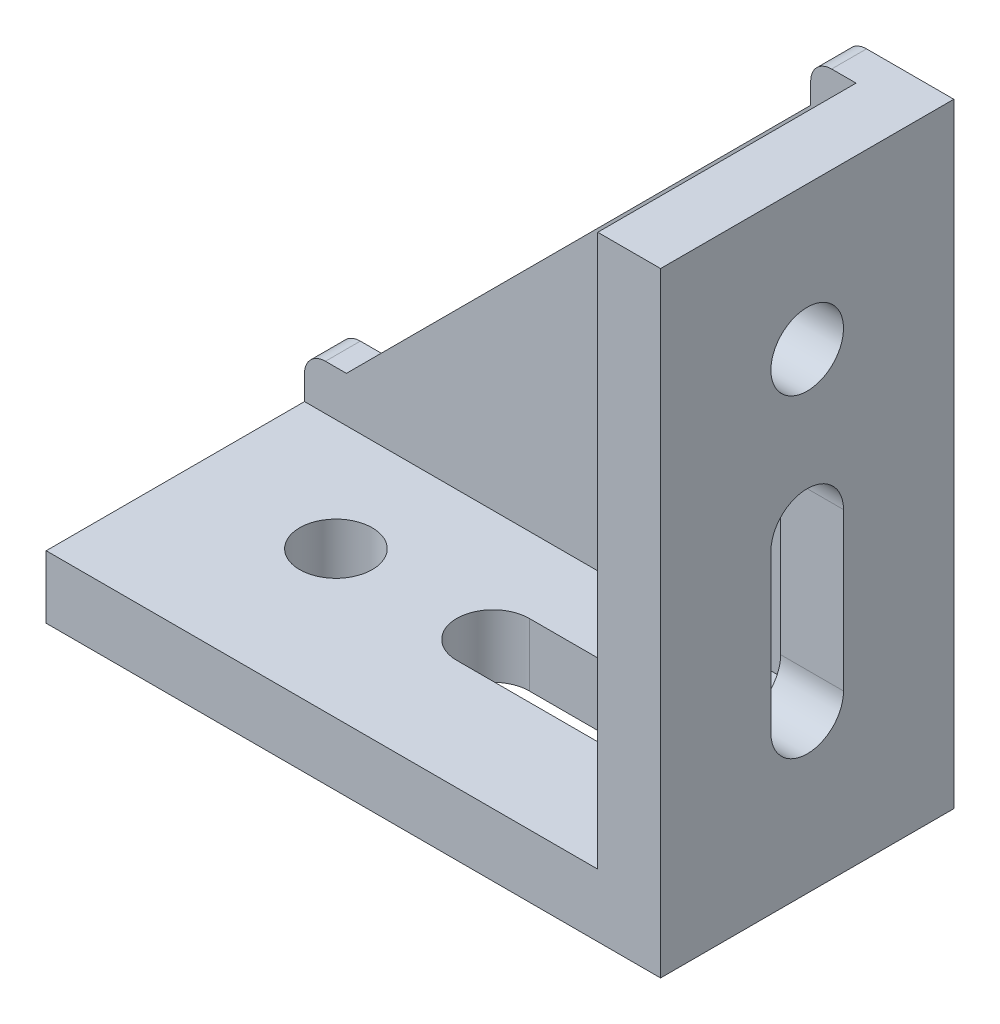
ISO-10303-21;
HEADER;
FILE_DESCRIPTION(('STEP AP214'),'2;1');
FILE_NAME('part.step','',(''),(''),'','','');
FILE_SCHEMA(('AUTOMOTIVE_DESIGN { 1 0 10303 214 1 1 1 1 }'));
ENDSEC;
DATA;
#1=APPLICATION_CONTEXT('core data for automotive mechanical design processes');
#2=APPLICATION_PROTOCOL_DEFINITION('international standard','automotive_design',2000,#1);
#3=PRODUCT_CONTEXT('',#1,'mechanical');
#4=PRODUCT('Part','Part','',(#3));
#5=PRODUCT_RELATED_PRODUCT_CATEGORY('part','',(#4));
#6=PRODUCT_DEFINITION_FORMATION('','',#4);
#7=PRODUCT_DEFINITION_CONTEXT('part definition',#1,'design');
#8=PRODUCT_DEFINITION('design','',#6,#7);
#9=PRODUCT_DEFINITION_SHAPE('','',#8);
#10=(LENGTH_UNIT() NAMED_UNIT(*) SI_UNIT(.MILLI.,.METRE.));
#11=(NAMED_UNIT(*) PLANE_ANGLE_UNIT() SI_UNIT($,.RADIAN.));
#12=(NAMED_UNIT(*) SI_UNIT($,.STERADIAN.) SOLID_ANGLE_UNIT());
#13=UNCERTAINTY_MEASURE_WITH_UNIT(LENGTH_MEASURE(1.E-05),#10,'distance_accuracy_value','');
#14=(GEOMETRIC_REPRESENTATION_CONTEXT(3) GLOBAL_UNCERTAINTY_ASSIGNED_CONTEXT((#13)) GLOBAL_UNIT_ASSIGNED_CONTEXT((#10,
#11,#12)) REPRESENTATION_CONTEXT('',''));
#15=CARTESIAN_POINT('',(0.,0.,0.));
#16=DIRECTION('',(0.,0.,1.));
#17=DIRECTION('',(1.,0.,0.));
#18=AXIS2_PLACEMENT_3D('',#15,#16,#17);
#19=CARTESIAN_POINT('',(-9.,9.,21.));
#20=DIRECTION('',(1.,0.,0.));
#21=DIRECTION('',(0.,0.,-1.));
#22=AXIS2_PLACEMENT_3D('',#19,#20,#21);
#23=PLANE('',#22);
#24=CARTESIAN_POINT('',(-8.99999999999998,45.,0.));
#25=DIRECTION('',(1.,0.,0.));
#26=DIRECTION('',(0.,0.,1.));
#27=AXIS2_PLACEMENT_3D('',#24,#25,#26);
#28=CIRCLE('',#27,5.2);
#29=CARTESIAN_POINT('',(-9.,45.,-5.2));
#30=VERTEX_POINT('',#29);
#31=CARTESIAN_POINT('',(-8.99999999999998,45.,5.2));
#32=VERTEX_POINT('',#31);
#33=EDGE_CURVE('E50',#30,#32,#28,.T.);
#34=ORIENTED_EDGE('',*,*,#33,.T.);
#35=DIRECTION('',(0.,-1.,0.));
#36=VECTOR('',#35,1.);
#37=CARTESIAN_POINT('',(-8.99999999999998,45.,5.2));
#38=LINE('',#37,#36);
#39=CARTESIAN_POINT('',(-8.99999999999999,22.5,5.2));
#40=VERTEX_POINT('',#39);
#41=EDGE_CURVE('E189',#32,#40,#38,.T.);
#42=ORIENTED_EDGE('',*,*,#41,.T.);
#43=CARTESIAN_POINT('',(-8.99999999999999,22.5,0.));
#44=DIRECTION('',(1.,0.,0.));
#45=DIRECTION('',(0.,0.,1.));
#46=AXIS2_PLACEMENT_3D('',#43,#44,#45);
#47=CIRCLE('',#46,5.2);
#48=CARTESIAN_POINT('',(-8.99999999999999,22.5,-5.2));
#49=VERTEX_POINT('',#48);
#50=EDGE_CURVE('E192',#40,#49,#47,.T.);
#51=ORIENTED_EDGE('',*,*,#50,.T.);
#52=DIRECTION('',(0.,1.,0.));
#53=VECTOR('',#52,1.);
#54=CARTESIAN_POINT('',(-8.99999999999998,45.,-5.2));
#55=LINE('',#54,#53);
#56=EDGE_CURVE('E201',#49,#30,#55,.T.);
#57=ORIENTED_EDGE('',*,*,#56,.T.);
#58=EDGE_LOOP('',(#34,#42,#51,#57));
#59=FACE_BOUND('',#58,.T.);
#60=DIRECTION('',(0.,-1.,0.));
#61=VECTOR('',#60,1.);
#62=CARTESIAN_POINT('',(-8.99999999999999,88.,-16.));
#63=LINE('',#62,#61);
#64=CARTESIAN_POINT('',(-9.,88.,-16.));
#65=VERTEX_POINT('',#64);
#66=CARTESIAN_POINT('',(-9.,9.,-16.));
#67=VERTEX_POINT('',#66);
#68=EDGE_CURVE('E274',#65,#67,#63,.T.);
#69=ORIENTED_EDGE('',*,*,#68,.T.);
#70=DIRECTION('',(0.,0.,-1.));
#71=VECTOR('',#70,1.);
#72=CARTESIAN_POINT('',(-9.,9.,21.));
#73=LINE('',#72,#71);
#74=CARTESIAN_POINT('',(-9.,9.,21.));
#75=VERTEX_POINT('',#74);
#76=EDGE_CURVE('E328',#75,#67,#73,.T.);
#77=ORIENTED_EDGE('',*,*,#76,.F.);
#78=DIRECTION('',(0.,-1.,0.));
#79=VECTOR('',#78,1.);
#80=CARTESIAN_POINT('',(-9.,9.,21.));
#81=LINE('',#80,#79);
#82=CARTESIAN_POINT('',(-9.,88.,21.));
#83=VERTEX_POINT('',#82);
#84=EDGE_CURVE('E314',#83,#75,#81,.T.);
#85=ORIENTED_EDGE('',*,*,#84,.F.);
#86=DIRECTION('',(0.,0.,-1.));
#87=VECTOR('',#86,1.);
#88=CARTESIAN_POINT('',(-9.,88.,21.));
#89=LINE('',#88,#87);
#90=EDGE_CURVE('E331',#83,#65,#89,.T.);
#91=ORIENTED_EDGE('',*,*,#90,.T.);
#92=EDGE_LOOP('',(#69,#77,#85,#91));
#93=FACE_BOUND('',#92,.T.);
#94=CARTESIAN_POINT('',(-8.99999999999997,67.5,0.));
#95=DIRECTION('',(1.,0.,0.));
#96=DIRECTION('',(0.,0.,1.));
#97=AXIS2_PLACEMENT_3D('',#94,#95,#96);
#98=CIRCLE('',#97,5.19999999999999);
#99=CARTESIAN_POINT('',(-8.99999999999997,67.5,5.19999999999999));
#100=VERTEX_POINT('',#99);
#101=EDGE_CURVE('E195',#100,#100,#98,.T.);
#102=ORIENTED_EDGE('',*,*,#101,.T.);
#103=EDGE_LOOP('',(#102));
#104=FACE_BOUND('',#103,.T.);
#105=ADVANCED_FACE('F35',(#59,#93,#104),#23,.F.);
#106=CARTESIAN_POINT('',(0.,0.,21.));
#107=DIRECTION('',(-1.,0.,0.));
#108=DIRECTION('',(0.,0.,1.));
#109=AXIS2_PLACEMENT_3D('',#106,#107,#108);
#110=PLANE('',#109);
#111=CARTESIAN_POINT('',(0.,45.,0.));
#112=DIRECTION('',(1.,0.,0.));
#113=DIRECTION('',(0.,0.,1.));
#114=AXIS2_PLACEMENT_3D('',#111,#112,#113);
#115=CIRCLE('',#114,5.2);
#116=CARTESIAN_POINT('',(0.,45.,-5.2));
#117=VERTEX_POINT('',#116);
#118=CARTESIAN_POINT('',(0.,45.,5.2));
#119=VERTEX_POINT('',#118);
#120=EDGE_CURVE('E180',#117,#119,#115,.T.);
#121=ORIENTED_EDGE('',*,*,#120,.F.);
#122=DIRECTION('',(0.,1.,0.));
#123=VECTOR('',#122,1.);
#124=CARTESIAN_POINT('',(0.,45.,-5.2));
#125=LINE('',#124,#123);
#126=CARTESIAN_POINT('',(0.,22.5,-5.2));
#127=VERTEX_POINT('',#126);
#128=EDGE_CURVE('E172',#127,#117,#125,.T.);
#129=ORIENTED_EDGE('',*,*,#128,.F.);
#130=CARTESIAN_POINT('',(0.,22.5,0.));
#131=DIRECTION('',(1.,0.,0.));
#132=DIRECTION('',(0.,0.,1.));
#133=AXIS2_PLACEMENT_3D('',#130,#131,#132);
#134=CIRCLE('',#133,5.2);
#135=CARTESIAN_POINT('',(0.,22.5,5.2));
#136=VERTEX_POINT('',#135);
#137=EDGE_CURVE('E179',#136,#127,#134,.T.);
#138=ORIENTED_EDGE('',*,*,#137,.F.);
#139=DIRECTION('',(0.,-1.,0.));
#140=VECTOR('',#139,1.);
#141=CARTESIAN_POINT('',(0.,45.,5.2));
#142=LINE('',#141,#140);
#143=EDGE_CURVE('E184',#119,#136,#142,.T.);
#144=ORIENTED_EDGE('',*,*,#143,.F.);
#145=EDGE_LOOP('',(#121,#129,#138,#144));
#146=FACE_BOUND('',#145,.T.);
#147=DIRECTION('',(0.,1.,0.));
#148=VECTOR('',#147,1.);
#149=CARTESIAN_POINT('',(0.,0.,-21.));
#150=LINE('',#149,#148);
#151=CARTESIAN_POINT('',(0.,0.,-21.));
#152=VERTEX_POINT('',#151);
#153=CARTESIAN_POINT('',(0.,88.,-21.));
#154=VERTEX_POINT('',#153);
#155=EDGE_CURVE('E323',#152,#154,#150,.T.);
#156=ORIENTED_EDGE('',*,*,#155,.T.);
#157=DIRECTION('',(0.,0.,-1.));
#158=VECTOR('',#157,1.);
#159=CARTESIAN_POINT('',(0.,88.,21.));
#160=LINE('',#159,#158);
#161=CARTESIAN_POINT('',(0.,88.,21.));
#162=VERTEX_POINT('',#161);
#163=EDGE_CURVE('E333',#162,#154,#160,.T.);
#164=ORIENTED_EDGE('',*,*,#163,.F.);
#165=DIRECTION('',(0.,1.,0.));
#166=VECTOR('',#165,1.);
#167=CARTESIAN_POINT('',(0.,0.,21.));
#168=LINE('',#167,#166);
#169=CARTESIAN_POINT('',(0.,0.,21.));
#170=VERTEX_POINT('',#169);
#171=EDGE_CURVE('E310',#170,#162,#168,.T.);
#172=ORIENTED_EDGE('',*,*,#171,.F.);
#173=DIRECTION('',(0.,0.,-1.));
#174=VECTOR('',#173,1.);
#175=CARTESIAN_POINT('',(0.,0.,21.));
#176=LINE('',#175,#174);
#177=EDGE_CURVE('E43',#170,#152,#176,.T.);
#178=ORIENTED_EDGE('',*,*,#177,.T.);
#179=EDGE_LOOP('',(#156,#164,#172,#178));
#180=FACE_BOUND('',#179,.T.);
#181=CARTESIAN_POINT('',(0.,67.5,0.));
#182=DIRECTION('',(1.,0.,0.));
#183=DIRECTION('',(0.,0.,1.));
#184=AXIS2_PLACEMENT_3D('',#181,#182,#183);
#185=CIRCLE('',#184,5.19999999999999);
#186=CARTESIAN_POINT('',(0.,67.5,5.19999999999999));
#187=VERTEX_POINT('',#186);
#188=EDGE_CURVE('E202',#187,#187,#185,.T.);
#189=ORIENTED_EDGE('',*,*,#188,.F.);
#190=EDGE_LOOP('',(#189));
#191=FACE_BOUND('',#190,.T.);
#192=ADVANCED_FACE('F187',(#146,#180,#191),#110,.F.);
#193=CARTESIAN_POINT('',(-88.,9.,21.));
#194=DIRECTION('',(0.,-1.,0.));
#195=DIRECTION('',(0.,0.,-1.));
#196=AXIS2_PLACEMENT_3D('',#193,#194,#195);
#197=PLANE('',#196);
#198=CARTESIAN_POINT('',(-67.5,9.,0.));
#199=DIRECTION('',(0.,1.,0.));
#200=DIRECTION('',(0.,0.,1.));
#201=AXIS2_PLACEMENT_3D('',#198,#199,#200);
#202=CIRCLE('',#201,5.19999999999999);
#203=CARTESIAN_POINT('',(-67.5,9.,5.19999999999999));
#204=VERTEX_POINT('',#203);
#205=EDGE_CURVE('E208',#204,#204,#202,.T.);
#206=ORIENTED_EDGE('',*,*,#205,.F.);
#207=EDGE_LOOP('',(#206));
#208=FACE_BOUND('',#207,.T.);
#209=DIRECTION('',(1.,0.,0.));
#210=VECTOR('',#209,1.);
#211=CARTESIAN_POINT('',(-45.,9.,5.2));
#212=LINE('',#211,#210);
#213=CARTESIAN_POINT('',(-45.,9.,5.2));
#214=VERTEX_POINT('',#213);
#215=CARTESIAN_POINT('',(-22.5,9.,5.2));
#216=VERTEX_POINT('',#215);
#217=EDGE_CURVE('E233',#214,#216,#212,.T.);
#218=ORIENTED_EDGE('',*,*,#217,.F.);
#219=CARTESIAN_POINT('',(-45.,9.,0.));
#220=DIRECTION('',(0.,1.,0.));
#221=DIRECTION('',(0.,0.,1.));
#222=AXIS2_PLACEMENT_3D('',#219,#220,#221);
#223=CIRCLE('',#222,5.2);
#224=CARTESIAN_POINT('',(-45.,9.,-5.2));
#225=VERTEX_POINT('',#224);
#226=EDGE_CURVE('E215',#225,#214,#223,.T.);
#227=ORIENTED_EDGE('',*,*,#226,.F.);
#228=DIRECTION('',(-1.,0.,0.));
#229=VECTOR('',#228,1.);
#230=CARTESIAN_POINT('',(-45.,9.,-5.2));
#231=LINE('',#230,#229);
#232=CARTESIAN_POINT('',(-22.5,9.,-5.2));
#233=VERTEX_POINT('',#232);
#234=EDGE_CURVE('E222',#233,#225,#231,.T.);
#235=ORIENTED_EDGE('',*,*,#234,.F.);
#236=CARTESIAN_POINT('',(-22.5,9.,0.));
#237=DIRECTION('',(0.,1.,0.));
#238=DIRECTION('',(0.,0.,1.));
#239=AXIS2_PLACEMENT_3D('',#236,#237,#238);
#240=CIRCLE('',#239,5.2);
#241=EDGE_CURVE('E236',#216,#233,#240,.T.);
#242=ORIENTED_EDGE('',*,*,#241,.F.);
#243=EDGE_LOOP('',(#218,#227,#235,#242));
#244=FACE_BOUND('',#243,.T.);
#245=DIRECTION('',(-1.,0.,0.));
#246=VECTOR('',#245,1.);
#247=CARTESIAN_POINT('',(-9.,9.,-16.));
#248=LINE('',#247,#246);
#249=CARTESIAN_POINT('',(-88.,9.,-16.));
#250=VERTEX_POINT('',#249);
#251=EDGE_CURVE('E250',#67,#250,#248,.T.);
#252=ORIENTED_EDGE('',*,*,#251,.T.);
#253=DIRECTION('',(0.,0.,-1.));
#254=VECTOR('',#253,1.);
#255=CARTESIAN_POINT('',(-88.,9.,21.));
#256=LINE('',#255,#254);
#257=CARTESIAN_POINT('',(-88.,9.,21.));
#258=VERTEX_POINT('',#257);
#259=EDGE_CURVE('E318',#258,#250,#256,.T.);
#260=ORIENTED_EDGE('',*,*,#259,.F.);
#261=DIRECTION('',(-1.,0.,0.));
#262=VECTOR('',#261,1.);
#263=CARTESIAN_POINT('',(-88.,9.,21.));
#264=LINE('',#263,#262);
#265=EDGE_CURVE('E316',#75,#258,#264,.T.);
#266=ORIENTED_EDGE('',*,*,#265,.F.);
#267=ORIENTED_EDGE('',*,*,#76,.T.);
#268=EDGE_LOOP('',(#252,#260,#266,#267));
#269=FACE_BOUND('',#268,.T.);
#270=ADVANCED_FACE('F380',(#208,#244,#269),#197,.F.);
#271=CARTESIAN_POINT('',(-88.,9.,21.));
#272=DIRECTION('',(1.,0.,0.));
#273=DIRECTION('',(0.,0.,-1.));
#274=AXIS2_PLACEMENT_3D('',#271,#272,#273);
#275=PLANE('',#274);
#276=DIRECTION('',(0.,-1.,0.));
#277=VECTOR('',#276,1.);
#278=CARTESIAN_POINT('',(-88.,9.,-21.));
#279=LINE('',#278,#277);
#280=CARTESIAN_POINT('',(-88.,12.5,-21.));
#281=VERTEX_POINT('',#280);
#282=CARTESIAN_POINT('',(-88.,0.,-21.));
#283=VERTEX_POINT('',#282);
#284=EDGE_CURVE('E293',#281,#283,#279,.T.);
#285=ORIENTED_EDGE('',*,*,#284,.T.);
#286=DIRECTION('',(0.,0.,-1.));
#287=VECTOR('',#286,1.);
#288=CARTESIAN_POINT('',(-88.,0.,21.));
#289=LINE('',#288,#287);
#290=CARTESIAN_POINT('',(-88.,0.,21.));
#291=VERTEX_POINT('',#290);
#292=EDGE_CURVE('E11',#291,#283,#289,.T.);
#293=ORIENTED_EDGE('',*,*,#292,.F.);
#294=DIRECTION('',(0.,-1.,0.));
#295=VECTOR('',#294,1.);
#296=CARTESIAN_POINT('',(-88.,9.,21.));
#297=LINE('',#296,#295);
#298=EDGE_CURVE('E304',#258,#291,#297,.T.);
#299=ORIENTED_EDGE('',*,*,#298,.F.);
#300=ORIENTED_EDGE('',*,*,#259,.T.);
#301=DIRECTION('',(0.,1.,0.));
#302=VECTOR('',#301,1.);
#303=CARTESIAN_POINT('',(-88.,9.,-16.));
#304=LINE('',#303,#302);
#305=CARTESIAN_POINT('',(-88.,12.5,-16.));
#306=VERTEX_POINT('',#305);
#307=EDGE_CURVE('E252',#250,#306,#304,.T.);
#308=ORIENTED_EDGE('',*,*,#307,.T.);
#309=DIRECTION('',(0.,0.,-1.));
#310=VECTOR('',#309,1.);
#311=CARTESIAN_POINT('',(-88.,12.5,-16.));
#312=LINE('',#311,#310);
#313=EDGE_CURVE('E276',#306,#281,#312,.T.);
#314=ORIENTED_EDGE('',*,*,#313,.T.);
#315=EDGE_LOOP('',(#285,#293,#299,#300,#308,#314));
#316=FACE_BOUND('',#315,.T.);
#317=ADVANCED_FACE('F37',(#316),#275,.F.);
#318=CARTESIAN_POINT('',(-88.,0.,21.));
#319=DIRECTION('',(0.,1.,0.));
#320=DIRECTION('',(0.,0.,1.));
#321=AXIS2_PLACEMENT_3D('',#318,#319,#320);
#322=PLANE('',#321);
#323=CARTESIAN_POINT('',(-67.5,0.,0.));
#324=DIRECTION('',(0.,1.,0.));
#325=DIRECTION('',(0.,0.,1.));
#326=AXIS2_PLACEMENT_3D('',#323,#324,#325);
#327=CIRCLE('',#326,5.19999999999999);
#328=CARTESIAN_POINT('',(-67.5,0.,5.19999999999999));
#329=VERTEX_POINT('',#328);
#330=EDGE_CURVE('E212',#329,#329,#327,.T.);
#331=ORIENTED_EDGE('',*,*,#330,.T.);
#332=EDGE_LOOP('',(#331));
#333=FACE_BOUND('',#332,.T.);
#334=DIRECTION('',(-1.,0.,0.));
#335=VECTOR('',#334,1.);
#336=CARTESIAN_POINT('',(-45.,0.,-5.2));
#337=LINE('',#336,#335);
#338=CARTESIAN_POINT('',(-22.5,0.,-5.2));
#339=VERTEX_POINT('',#338);
#340=CARTESIAN_POINT('',(-45.,0.,-5.2));
#341=VERTEX_POINT('',#340);
#342=EDGE_CURVE('E228',#339,#341,#337,.T.);
#343=ORIENTED_EDGE('',*,*,#342,.T.);
#344=CARTESIAN_POINT('',(-45.,0.,0.));
#345=DIRECTION('',(0.,1.,0.));
#346=DIRECTION('',(0.,0.,1.));
#347=AXIS2_PLACEMENT_3D('',#344,#345,#346);
#348=CIRCLE('',#347,5.2);
#349=CARTESIAN_POINT('',(-45.,0.,5.2));
#350=VERTEX_POINT('',#349);
#351=EDGE_CURVE('E218',#341,#350,#348,.T.);
#352=ORIENTED_EDGE('',*,*,#351,.T.);
#353=DIRECTION('',(1.,0.,0.));
#354=VECTOR('',#353,1.);
#355=CARTESIAN_POINT('',(-45.,0.,5.2));
#356=LINE('',#355,#354);
#357=CARTESIAN_POINT('',(-22.5,0.,5.2));
#358=VERTEX_POINT('',#357);
#359=EDGE_CURVE('E221',#350,#358,#356,.T.);
#360=ORIENTED_EDGE('',*,*,#359,.T.);
#361=CARTESIAN_POINT('',(-22.5,0.,0.));
#362=DIRECTION('',(0.,1.,0.));
#363=DIRECTION('',(0.,0.,1.));
#364=AXIS2_PLACEMENT_3D('',#361,#362,#363);
#365=CIRCLE('',#364,5.2);
#366=EDGE_CURVE('E225',#358,#339,#365,.T.);
#367=ORIENTED_EDGE('',*,*,#366,.T.);
#368=EDGE_LOOP('',(#343,#352,#360,#367));
#369=FACE_BOUND('',#368,.T.);
#370=DIRECTION('',(1.,0.,0.));
#371=VECTOR('',#370,1.);
#372=CARTESIAN_POINT('',(-88.,0.,-21.));
#373=LINE('',#372,#371);
#374=EDGE_CURVE('E321',#283,#152,#373,.T.);
#375=ORIENTED_EDGE('',*,*,#374,.T.);
#376=ORIENTED_EDGE('',*,*,#177,.F.);
#377=DIRECTION('',(1.,0.,0.));
#378=VECTOR('',#377,1.);
#379=CARTESIAN_POINT('',(-88.,0.,21.));
#380=LINE('',#379,#378);
#381=EDGE_CURVE('E307',#291,#170,#380,.T.);
#382=ORIENTED_EDGE('',*,*,#381,.F.);
#383=ORIENTED_EDGE('',*,*,#292,.T.);
#384=EDGE_LOOP('',(#375,#376,#382,#383));
#385=FACE_BOUND('',#384,.T.);
#386=ADVANCED_FACE('F388',(#333,#369,#385),#322,.F.);
#387=CARTESIAN_POINT('',(-9.,88.,21.));
#388=DIRECTION('',(0.,-1.,0.));
#389=DIRECTION('',(0.,0.,-1.));
#390=AXIS2_PLACEMENT_3D('',#387,#388,#389);
#391=PLANE('',#390);
#392=DIRECTION('',(-1.,0.,0.));
#393=VECTOR('',#392,1.);
#394=CARTESIAN_POINT('',(-9.,88.,-21.));
#395=LINE('',#394,#393);
#396=CARTESIAN_POINT('',(-12.5,88.,-21.));
#397=VERTEX_POINT('',#396);
#398=EDGE_CURVE('E308',#154,#397,#395,.T.);
#399=ORIENTED_EDGE('',*,*,#398,.T.);
#400=DIRECTION('',(0.,0.,-1.));
#401=VECTOR('',#400,1.);
#402=CARTESIAN_POINT('',(-12.5,88.,-16.));
#403=LINE('',#402,#401);
#404=CARTESIAN_POINT('',(-12.5,88.,-16.));
#405=VERTEX_POINT('',#404);
#406=EDGE_CURVE('E290',#405,#397,#403,.T.);
#407=ORIENTED_EDGE('',*,*,#406,.F.);
#408=DIRECTION('',(1.,0.,0.));
#409=VECTOR('',#408,1.);
#410=CARTESIAN_POINT('',(-8.99999999999999,88.,-16.));
#411=LINE('',#410,#409);
#412=EDGE_CURVE('E271',#405,#65,#411,.T.);
#413=ORIENTED_EDGE('',*,*,#412,.T.);
#414=ORIENTED_EDGE('',*,*,#90,.F.);
#415=DIRECTION('',(-1.,0.,0.));
#416=VECTOR('',#415,1.);
#417=CARTESIAN_POINT('',(-9.,88.,21.));
#418=LINE('',#417,#416);
#419=EDGE_CURVE('E312',#162,#83,#418,.T.);
#420=ORIENTED_EDGE('',*,*,#419,.F.);
#421=ORIENTED_EDGE('',*,*,#163,.T.);
#422=EDGE_LOOP('',(#399,#407,#413,#414,#420,#421));
#423=FACE_BOUND('',#422,.T.);
#424=ADVANCED_FACE('F347',(#423),#391,.F.);
#425=CARTESIAN_POINT('',(0.,0.,21.));
#426=DIRECTION('',(0.,0.,1.));
#427=DIRECTION('',(1.,0.,0.));
#428=AXIS2_PLACEMENT_3D('',#425,#426,#427);
#429=PLANE('',#428);
#430=ORIENTED_EDGE('',*,*,#298,.T.);
#431=ORIENTED_EDGE('',*,*,#381,.T.);
#432=ORIENTED_EDGE('',*,*,#171,.T.);
#433=ORIENTED_EDGE('',*,*,#419,.T.);
#434=ORIENTED_EDGE('',*,*,#84,.T.);
#435=ORIENTED_EDGE('',*,*,#265,.T.);
#436=EDGE_LOOP('',(#430,#431,#432,#433,#434,#435));
#437=FACE_BOUND('',#436,.T.);
#438=ADVANCED_FACE('F387',(#437),#429,.T.);
#439=CARTESIAN_POINT('',(0.,0.,-21.));
#440=DIRECTION('',(0.,0.,1.));
#441=DIRECTION('',(1.,0.,0.));
#442=AXIS2_PLACEMENT_3D('',#439,#440,#441);
#443=PLANE('',#442);
#444=ORIENTED_EDGE('',*,*,#284,.F.);
#445=CARTESIAN_POINT('',(-85.,12.5,-21.));
#446=DIRECTION('',(0.,0.,-1.));
#447=DIRECTION('',(-1.,0.,0.));
#448=AXIS2_PLACEMENT_3D('',#445,#446,#447);
#449=CIRCLE('',#448,3.);
#450=CARTESIAN_POINT('',(-85.,15.5,-21.));
#451=VERTEX_POINT('',#450);
#452=EDGE_CURVE('E243',#281,#451,#449,.T.);
#453=ORIENTED_EDGE('',*,*,#452,.T.);
#454=DIRECTION('',(1.,0.,0.));
#455=VECTOR('',#454,1.);
#456=CARTESIAN_POINT('',(-85.,15.5,-21.));
#457=LINE('',#456,#455);
#458=CARTESIAN_POINT('',(-82.,15.5,-21.));
#459=VERTEX_POINT('',#458);
#460=EDGE_CURVE('E279',#451,#459,#457,.T.);
#461=ORIENTED_EDGE('',*,*,#460,.T.);
#462=DIRECTION('',(0.707106781186548,0.707106781186547,0.));
#463=VECTOR('',#462,1.);
#464=CARTESIAN_POINT('',(-82.,15.5,-21.));
#465=LINE('',#464,#463);
#466=CARTESIAN_POINT('',(-15.5,82.,-21.));
#467=VERTEX_POINT('',#466);
#468=EDGE_CURVE('E282',#459,#467,#465,.T.);
#469=ORIENTED_EDGE('',*,*,#468,.T.);
#470=DIRECTION('',(0.,1.,0.));
#471=VECTOR('',#470,1.);
#472=CARTESIAN_POINT('',(-15.5,85.,-21.));
#473=LINE('',#472,#471);
#474=CARTESIAN_POINT('',(-15.5,85.,-21.));
#475=VERTEX_POINT('',#474);
#476=EDGE_CURVE('E285',#467,#475,#473,.T.);
#477=ORIENTED_EDGE('',*,*,#476,.T.);
#478=CARTESIAN_POINT('',(-12.5,85.,-21.));
#479=DIRECTION('',(0.,0.,-1.));
#480=DIRECTION('',(1.,0.,0.));
#481=AXIS2_PLACEMENT_3D('',#478,#479,#480);
#482=CIRCLE('',#481,3.);
#483=EDGE_CURVE('E253',#475,#397,#482,.T.);
#484=ORIENTED_EDGE('',*,*,#483,.T.);
#485=ORIENTED_EDGE('',*,*,#398,.F.);
#486=ORIENTED_EDGE('',*,*,#155,.F.);
#487=ORIENTED_EDGE('',*,*,#374,.F.);
#488=EDGE_LOOP('',(#444,#453,#461,#469,#477,#484,#485,#486,#487));
#489=FACE_BOUND('',#488,.T.);
#490=ADVANCED_FACE('F344',(#489),#443,.F.);
#491=CARTESIAN_POINT('',(-12.5,85.,-16.));
#492=DIRECTION('',(0.,0.,-1.));
#493=DIRECTION('',(-1.,0.,0.));
#494=AXIS2_PLACEMENT_3D('',#491,#492,#493);
#495=CYLINDRICAL_SURFACE('',#494,3.);
#496=ORIENTED_EDGE('',*,*,#483,.F.);
#497=DIRECTION('',(0.,0.,-1.));
#498=VECTOR('',#497,1.);
#499=CARTESIAN_POINT('',(-15.5,85.,-16.));
#500=LINE('',#499,#498);
#501=CARTESIAN_POINT('',(-15.5,85.,-16.));
#502=VERTEX_POINT('',#501);
#503=EDGE_CURVE('E294',#502,#475,#500,.T.);
#504=ORIENTED_EDGE('',*,*,#503,.F.);
#505=CARTESIAN_POINT('',(-12.5,85.,-16.));
#506=DIRECTION('',(0.,0.,-1.));
#507=DIRECTION('',(1.,0.,0.));
#508=AXIS2_PLACEMENT_3D('',#505,#506,#507);
#509=CIRCLE('',#508,3.);
#510=EDGE_CURVE('E268',#502,#405,#509,.T.);
#511=ORIENTED_EDGE('',*,*,#510,.T.);
#512=ORIENTED_EDGE('',*,*,#406,.T.);
#513=EDGE_LOOP('',(#496,#504,#511,#512));
#514=FACE_BOUND('',#513,.T.);
#515=ADVANCED_FACE('F351',(#514),#495,.T.);
#516=CARTESIAN_POINT('',(-15.5,85.,-16.));
#517=DIRECTION('',(-1.,0.,0.));
#518=DIRECTION('',(0.,0.,1.));
#519=AXIS2_PLACEMENT_3D('',#516,#517,#518);
#520=PLANE('',#519);
#521=ORIENTED_EDGE('',*,*,#476,.F.);
#522=DIRECTION('',(0.,0.,-1.));
#523=VECTOR('',#522,1.);
#524=CARTESIAN_POINT('',(-15.5,82.,-16.));
#525=LINE('',#524,#523);
#526=CARTESIAN_POINT('',(-15.5,82.,-16.));
#527=VERTEX_POINT('',#526);
#528=EDGE_CURVE('E296',#527,#467,#525,.T.);
#529=ORIENTED_EDGE('',*,*,#528,.F.);
#530=DIRECTION('',(0.,1.,0.));
#531=VECTOR('',#530,1.);
#532=CARTESIAN_POINT('',(-15.5,85.,-16.));
#533=LINE('',#532,#531);
#534=EDGE_CURVE('E265',#527,#502,#533,.T.);
#535=ORIENTED_EDGE('',*,*,#534,.T.);
#536=ORIENTED_EDGE('',*,*,#503,.T.);
#537=EDGE_LOOP('',(#521,#529,#535,#536));
#538=FACE_BOUND('',#537,.T.);
#539=ADVANCED_FACE('F361',(#538),#520,.T.);
#540=CARTESIAN_POINT('',(-82.,15.5,-16.));
#541=DIRECTION('',(-0.707106781186547,0.707106781186548,0.));
#542=DIRECTION('',(-0.707106781186548,-0.707106781186547,0.));
#543=AXIS2_PLACEMENT_3D('',#540,#541,#542);
#544=PLANE('',#543);
#545=ORIENTED_EDGE('',*,*,#468,.F.);
#546=DIRECTION('',(0.,0.,-1.));
#547=VECTOR('',#546,1.);
#548=CARTESIAN_POINT('',(-82.,15.5,-16.));
#549=LINE('',#548,#547);
#550=CARTESIAN_POINT('',(-82.,15.5,-16.));
#551=VERTEX_POINT('',#550);
#552=EDGE_CURVE('E298',#551,#459,#549,.T.);
#553=ORIENTED_EDGE('',*,*,#552,.F.);
#554=DIRECTION('',(0.707106781186548,0.707106781186547,0.));
#555=VECTOR('',#554,1.);
#556=CARTESIAN_POINT('',(-82.,15.5,-16.));
#557=LINE('',#556,#555);
#558=EDGE_CURVE('E262',#551,#527,#557,.T.);
#559=ORIENTED_EDGE('',*,*,#558,.T.);
#560=ORIENTED_EDGE('',*,*,#528,.T.);
#561=EDGE_LOOP('',(#545,#553,#559,#560));
#562=FACE_BOUND('',#561,.T.);
#563=ADVANCED_FACE('F364',(#562),#544,.T.);
#564=CARTESIAN_POINT('',(-85.,15.5,-16.));
#565=DIRECTION('',(0.,1.,0.));
#566=DIRECTION('',(0.,0.,1.));
#567=AXIS2_PLACEMENT_3D('',#564,#565,#566);
#568=PLANE('',#567);
#569=ORIENTED_EDGE('',*,*,#460,.F.);
#570=DIRECTION('',(0.,0.,-1.));
#571=VECTOR('',#570,1.);
#572=CARTESIAN_POINT('',(-85.,15.5,-16.));
#573=LINE('',#572,#571);
#574=CARTESIAN_POINT('',(-85.,15.5,-16.));
#575=VERTEX_POINT('',#574);
#576=EDGE_CURVE('E300',#575,#451,#573,.T.);
#577=ORIENTED_EDGE('',*,*,#576,.F.);
#578=DIRECTION('',(1.,0.,0.));
#579=VECTOR('',#578,1.);
#580=CARTESIAN_POINT('',(-85.,15.5,-16.));
#581=LINE('',#580,#579);
#582=EDGE_CURVE('E259',#575,#551,#581,.T.);
#583=ORIENTED_EDGE('',*,*,#582,.T.);
#584=ORIENTED_EDGE('',*,*,#552,.T.);
#585=EDGE_LOOP('',(#569,#577,#583,#584));
#586=FACE_BOUND('',#585,.T.);
#587=ADVANCED_FACE('F369',(#586),#568,.T.);
#588=CARTESIAN_POINT('',(-85.,12.5,-16.));
#589=DIRECTION('',(0.,0.,-1.));
#590=DIRECTION('',(-1.,0.,0.));
#591=AXIS2_PLACEMENT_3D('',#588,#589,#590);
#592=CYLINDRICAL_SURFACE('',#591,3.);
#593=ORIENTED_EDGE('',*,*,#452,.F.);
#594=ORIENTED_EDGE('',*,*,#313,.F.);
#595=CARTESIAN_POINT('',(-85.,12.5,-16.));
#596=DIRECTION('',(0.,0.,-1.));
#597=DIRECTION('',(-1.,0.,0.));
#598=AXIS2_PLACEMENT_3D('',#595,#596,#597);
#599=CIRCLE('',#598,3.);
#600=EDGE_CURVE('E256',#306,#575,#599,.T.);
#601=ORIENTED_EDGE('',*,*,#600,.T.);
#602=ORIENTED_EDGE('',*,*,#576,.T.);
#603=EDGE_LOOP('',(#593,#594,#601,#602));
#604=FACE_BOUND('',#603,.T.);
#605=ADVANCED_FACE('F372',(#604),#592,.T.);
#606=CARTESIAN_POINT('',(-85.,12.5,-16.));
#607=DIRECTION('',(0.,0.,-1.));
#608=DIRECTION('',(-1.,0.,0.));
#609=AXIS2_PLACEMENT_3D('',#606,#607,#608);
#610=PLANE('',#609);
#611=ORIENTED_EDGE('',*,*,#251,.F.);
#612=ORIENTED_EDGE('',*,*,#68,.F.);
#613=ORIENTED_EDGE('',*,*,#412,.F.);
#614=ORIENTED_EDGE('',*,*,#510,.F.);
#615=ORIENTED_EDGE('',*,*,#534,.F.);
#616=ORIENTED_EDGE('',*,*,#558,.F.);
#617=ORIENTED_EDGE('',*,*,#582,.F.);
#618=ORIENTED_EDGE('',*,*,#600,.F.);
#619=ORIENTED_EDGE('',*,*,#307,.F.);
#620=EDGE_LOOP('',(#611,#612,#613,#614,#615,#616,#617,#618,#619));
#621=FACE_BOUND('',#620,.T.);
#622=ADVANCED_FACE('F356',(#621),#610,.F.);
#623=CARTESIAN_POINT('',(-45.,0.,0.));
#624=DIRECTION('',(0.,1.,0.));
#625=DIRECTION('',(0.,0.,1.));
#626=AXIS2_PLACEMENT_3D('',#623,#624,#625);
#627=CYLINDRICAL_SURFACE('',#626,5.2);
#628=ORIENTED_EDGE('',*,*,#226,.T.);
#629=DIRECTION('',(0.,1.,0.));
#630=VECTOR('',#629,1.);
#631=CARTESIAN_POINT('',(-45.,0.,5.2));
#632=LINE('',#631,#630);
#633=EDGE_CURVE('E231',#350,#214,#632,.T.);
#634=ORIENTED_EDGE('',*,*,#633,.F.);
#635=ORIENTED_EDGE('',*,*,#351,.F.);
#636=DIRECTION('',(0.,1.,0.));
#637=VECTOR('',#636,1.);
#638=CARTESIAN_POINT('',(-45.,0.,-5.2));
#639=LINE('',#638,#637);
#640=EDGE_CURVE('E241',#341,#225,#639,.T.);
#641=ORIENTED_EDGE('',*,*,#640,.T.);
#642=EDGE_LOOP('',(#628,#634,#635,#641));
#643=FACE_BOUND('',#642,.T.);
#644=ADVANCED_FACE('F424',(#643),#627,.F.);
#645=CARTESIAN_POINT('',(-45.,0.,-5.2));
#646=DIRECTION('',(0.,0.,-1.));
#647=DIRECTION('',(-1.,0.,0.));
#648=AXIS2_PLACEMENT_3D('',#645,#646,#647);
#649=PLANE('',#648);
#650=ORIENTED_EDGE('',*,*,#234,.T.);
#651=ORIENTED_EDGE('',*,*,#640,.F.);
#652=ORIENTED_EDGE('',*,*,#342,.F.);
#653=DIRECTION('',(0.,1.,0.));
#654=VECTOR('',#653,1.);
#655=CARTESIAN_POINT('',(-22.5,0.,-5.2));
#656=LINE('',#655,#654);
#657=EDGE_CURVE('E244',#339,#233,#656,.T.);
#658=ORIENTED_EDGE('',*,*,#657,.T.);
#659=EDGE_LOOP('',(#650,#651,#652,#658));
#660=FACE_BOUND('',#659,.T.);
#661=ADVANCED_FACE('F427',(#660),#649,.F.);
#662=CARTESIAN_POINT('',(-22.5,0.,0.));
#663=DIRECTION('',(0.,1.,0.));
#664=DIRECTION('',(0.,0.,1.));
#665=AXIS2_PLACEMENT_3D('',#662,#663,#664);
#666=CYLINDRICAL_SURFACE('',#665,5.2);
#667=ORIENTED_EDGE('',*,*,#241,.T.);
#668=ORIENTED_EDGE('',*,*,#657,.F.);
#669=ORIENTED_EDGE('',*,*,#366,.F.);
#670=DIRECTION('',(0.,1.,0.));
#671=VECTOR('',#670,1.);
#672=CARTESIAN_POINT('',(-22.5,0.,5.2));
#673=LINE('',#672,#671);
#674=EDGE_CURVE('E246',#358,#216,#673,.T.);
#675=ORIENTED_EDGE('',*,*,#674,.T.);
#676=EDGE_LOOP('',(#667,#668,#669,#675));
#677=FACE_BOUND('',#676,.T.);
#678=ADVANCED_FACE('F433',(#677),#666,.F.);
#679=CARTESIAN_POINT('',(-45.,0.,5.2));
#680=DIRECTION('',(0.,0.,1.));
#681=DIRECTION('',(1.,0.,0.));
#682=AXIS2_PLACEMENT_3D('',#679,#680,#681);
#683=PLANE('',#682);
#684=ORIENTED_EDGE('',*,*,#217,.T.);
#685=ORIENTED_EDGE('',*,*,#674,.F.);
#686=ORIENTED_EDGE('',*,*,#359,.F.);
#687=ORIENTED_EDGE('',*,*,#633,.T.);
#688=EDGE_LOOP('',(#684,#685,#686,#687));
#689=FACE_BOUND('',#688,.T.);
#690=ADVANCED_FACE('F429',(#689),#683,.F.);
#691=CARTESIAN_POINT('',(-67.5,0.,0.));
#692=DIRECTION('',(0.,1.,0.));
#693=DIRECTION('',(0.,0.,1.));
#694=AXIS2_PLACEMENT_3D('',#691,#692,#693);
#695=CYLINDRICAL_SURFACE('',#694,5.19999999999999);
#696=ORIENTED_EDGE('',*,*,#330,.F.);
#697=EDGE_LOOP('',(#696));
#698=FACE_BOUND('',#697,.T.);
#699=ORIENTED_EDGE('',*,*,#205,.T.);
#700=EDGE_LOOP('',(#699));
#701=FACE_BOUND('',#700,.T.);
#702=ADVANCED_FACE('F432',(#698,#701),#695,.F.);
#703=CARTESIAN_POINT('',(0.,45.,0.));
#704=DIRECTION('',(-1.,0.,0.));
#705=DIRECTION('',(0.,-1.,0.));
#706=AXIS2_PLACEMENT_3D('',#703,#704,#705);
#707=CYLINDRICAL_SURFACE('',#706,5.2);
#708=ORIENTED_EDGE('',*,*,#33,.F.);
#709=DIRECTION('',(-1.,0.,0.));
#710=VECTOR('',#709,1.);
#711=CARTESIAN_POINT('',(0.,45.,-5.2));
#712=LINE('',#711,#710);
#713=EDGE_CURVE('E174',#117,#30,#712,.T.);
#714=ORIENTED_EDGE('',*,*,#713,.F.);
#715=ORIENTED_EDGE('',*,*,#120,.T.);
#716=DIRECTION('',(-1.,0.,0.));
#717=VECTOR('',#716,1.);
#718=CARTESIAN_POINT('',(0.,45.,5.2));
#719=LINE('',#718,#717);
#720=EDGE_CURVE('E206',#119,#32,#719,.T.);
#721=ORIENTED_EDGE('',*,*,#720,.T.);
#722=EDGE_LOOP('',(#708,#714,#715,#721));
#723=FACE_BOUND('',#722,.T.);
#724=ADVANCED_FACE('F182',(#723),#707,.F.);
#725=CARTESIAN_POINT('',(0.,45.,5.2));
#726=DIRECTION('',(0.,0.,-1.));
#727=DIRECTION('',(-1.,0.,0.));
#728=AXIS2_PLACEMENT_3D('',#725,#726,#727);
#729=PLANE('',#728);
#730=ORIENTED_EDGE('',*,*,#41,.F.);
#731=ORIENTED_EDGE('',*,*,#720,.F.);
#732=ORIENTED_EDGE('',*,*,#143,.T.);
#733=DIRECTION('',(-1.,0.,0.));
#734=VECTOR('',#733,1.);
#735=CARTESIAN_POINT('',(0.,22.5,5.2));
#736=LINE('',#735,#734);
#737=EDGE_CURVE('E209',#136,#40,#736,.T.);
#738=ORIENTED_EDGE('',*,*,#737,.T.);
#739=EDGE_LOOP('',(#730,#731,#732,#738));
#740=FACE_BOUND('',#739,.T.);
#741=ADVANCED_FACE('F446',(#740),#729,.T.);
#742=CARTESIAN_POINT('',(0.,22.5,0.));
#743=DIRECTION('',(-1.,0.,0.));
#744=DIRECTION('',(0.,-1.,0.));
#745=AXIS2_PLACEMENT_3D('',#742,#743,#744);
#746=CYLINDRICAL_SURFACE('',#745,5.2);
#747=ORIENTED_EDGE('',*,*,#50,.F.);
#748=ORIENTED_EDGE('',*,*,#737,.F.);
#749=ORIENTED_EDGE('',*,*,#137,.T.);
#750=DIRECTION('',(-1.,0.,0.));
#751=VECTOR('',#750,1.);
#752=CARTESIAN_POINT('',(0.,22.5,-5.2));
#753=LINE('',#752,#751);
#754=EDGE_CURVE('E58',#127,#49,#753,.T.);
#755=ORIENTED_EDGE('',*,*,#754,.T.);
#756=EDGE_LOOP('',(#747,#748,#749,#755));
#757=FACE_BOUND('',#756,.T.);
#758=ADVANCED_FACE('F450',(#757),#746,.F.);
#759=CARTESIAN_POINT('',(0.,45.,-5.2));
#760=DIRECTION('',(0.,0.,1.));
#761=DIRECTION('',(1.,0.,0.));
#762=AXIS2_PLACEMENT_3D('',#759,#760,#761);
#763=PLANE('',#762);
#764=ORIENTED_EDGE('',*,*,#56,.F.);
#765=ORIENTED_EDGE('',*,*,#754,.F.);
#766=ORIENTED_EDGE('',*,*,#128,.T.);
#767=ORIENTED_EDGE('',*,*,#713,.T.);
#768=EDGE_LOOP('',(#764,#765,#766,#767));
#769=FACE_BOUND('',#768,.T.);
#770=ADVANCED_FACE('F173',(#769),#763,.T.);
#771=CARTESIAN_POINT('',(0.,67.5,0.));
#772=DIRECTION('',(-1.,0.,0.));
#773=DIRECTION('',(0.,-1.,0.));
#774=AXIS2_PLACEMENT_3D('',#771,#772,#773);
#775=CYLINDRICAL_SURFACE('',#774,5.19999999999999);
#776=ORIENTED_EDGE('',*,*,#188,.T.);
#777=EDGE_LOOP('',(#776));
#778=FACE_BOUND('',#777,.T.);
#779=ORIENTED_EDGE('',*,*,#101,.F.);
#780=EDGE_LOOP('',(#779));
#781=FACE_BOUND('',#780,.T.);
#782=ADVANCED_FACE('F449',(#778,#781),#775,.F.);
#783=CLOSED_SHELL('',(#105,#192,#270,#317,#386,#424,#438,#490,#515,#539,#563,#587,#605,#622,
#644,#661,#678,#690,#702,#724,#741,#758,#770,#782));
#784=MANIFOLD_SOLID_BREP('B2',#783);
#785=ADVANCED_BREP_SHAPE_REPRESENTATION('',(#18,#784),#14);
#786=SHAPE_DEFINITION_REPRESENTATION(#9,#785);
ENDSEC;
END-ISO-10303-21;
